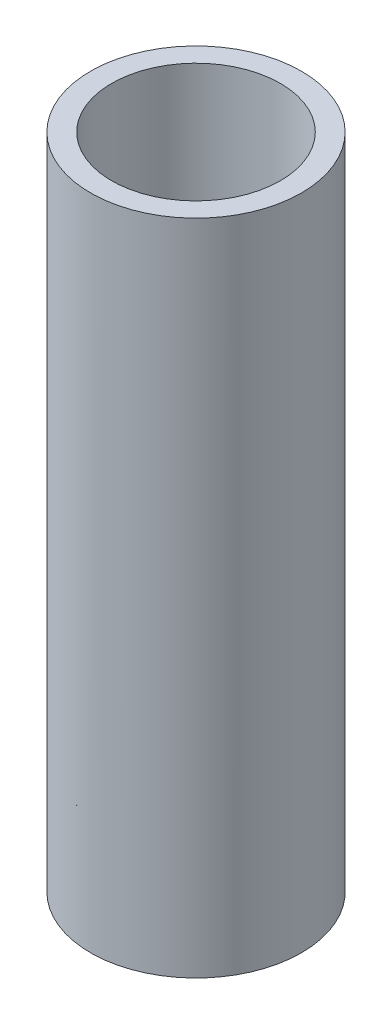
ISO-10303-21;
HEADER;
FILE_DESCRIPTION(('STEP AP214'),'2;1');
FILE_NAME('part.step','',(''),(''),'','','');
FILE_SCHEMA(('AUTOMOTIVE_DESIGN { 1 0 10303 214 1 1 1 1 }'));
ENDSEC;
DATA;
#1=APPLICATION_CONTEXT('core data for automotive mechanical design processes');
#2=APPLICATION_PROTOCOL_DEFINITION('international standard','automotive_design',2000,#1);
#3=PRODUCT_CONTEXT('',#1,'mechanical');
#4=PRODUCT('Part','Part','',(#3));
#5=PRODUCT_RELATED_PRODUCT_CATEGORY('part','',(#4));
#6=PRODUCT_DEFINITION_FORMATION('','',#4);
#7=PRODUCT_DEFINITION_CONTEXT('part definition',#1,'design');
#8=PRODUCT_DEFINITION('design','',#6,#7);
#9=PRODUCT_DEFINITION_SHAPE('','',#8);
#10=(LENGTH_UNIT() NAMED_UNIT(*) SI_UNIT(.MILLI.,.METRE.));
#11=(NAMED_UNIT(*) PLANE_ANGLE_UNIT() SI_UNIT($,.RADIAN.));
#12=(NAMED_UNIT(*) SI_UNIT($,.STERADIAN.) SOLID_ANGLE_UNIT());
#13=UNCERTAINTY_MEASURE_WITH_UNIT(LENGTH_MEASURE(1.E-05),#10,'distance_accuracy_value','');
#14=(GEOMETRIC_REPRESENTATION_CONTEXT(3) GLOBAL_UNCERTAINTY_ASSIGNED_CONTEXT((#13)) GLOBAL_UNIT_ASSIGNED_CONTEXT((#10,
#11,#12)) REPRESENTATION_CONTEXT('',''));
#15=CARTESIAN_POINT('',(0.,0.,0.));
#16=DIRECTION('',(0.,0.,1.));
#17=DIRECTION('',(1.,0.,0.));
#18=AXIS2_PLACEMENT_3D('',#15,#16,#17);
#19=CARTESIAN_POINT('',(-12.7,-1.905,19.05));
#20=DIRECTION('',(0.,-1.,0.));
#21=DIRECTION('',(1.,0.,0.));
#22=AXIS2_PLACEMENT_3D('',#19,#20,#21);
#23=PLANE('',#22);
#24=CARTESIAN_POINT('',(-31.75,-1.90499999999999,0.));
#25=DIRECTION('',(0.,-1.,0.));
#26=DIRECTION('',(1.,0.,0.));
#27=AXIS2_PLACEMENT_3D('',#24,#25,#26);
#28=CIRCLE('',#27,15.875);
#29=CARTESIAN_POINT('',(-15.875,-1.90499999999999,0.));
#30=VERTEX_POINT('',#29);
#31=EDGE_CURVE('E44',#30,#30,#28,.F.);
#32=ORIENTED_EDGE('',*,*,#31,.F.);
#33=EDGE_LOOP('',(#32));
#34=FACE_BOUND('',#33,.T.);
#35=CARTESIAN_POINT('',(-31.75,-1.90499999999999,0.));
#36=DIRECTION('',(0.,-1.,0.));
#37=DIRECTION('',(1.,0.,0.));
#38=AXIS2_PLACEMENT_3D('',#35,#36,#37);
#39=CIRCLE('',#38,12.7);
#40=CARTESIAN_POINT('',(-19.05,-1.90499999999999,0.));
#41=VERTEX_POINT('',#40);
#42=EDGE_CURVE('E36',#41,#41,#39,.T.);
#43=ORIENTED_EDGE('',*,*,#42,.F.);
#44=EDGE_LOOP('',(#43));
#45=FACE_BOUND('',#44,.T.);
#46=ADVANCED_FACE('F33',(#34,#45),#23,.T.);
#47=CARTESIAN_POINT('',(-17.7800000000001,97.155,-19.05));
#48=DIRECTION('',(0.,-1.,0.));
#49=DIRECTION('',(0.,0.,-1.));
#50=AXIS2_PLACEMENT_3D('',#47,#48,#49);
#51=PLANE('',#50);
#52=CARTESIAN_POINT('',(-31.75,97.155,0.));
#53=DIRECTION('',(0.,-1.,0.));
#54=DIRECTION('',(0.,0.,-1.));
#55=AXIS2_PLACEMENT_3D('',#52,#53,#54);
#56=CIRCLE('',#55,12.7);
#57=CARTESIAN_POINT('',(-31.75,97.155,-12.7));
#58=VERTEX_POINT('',#57);
#59=EDGE_CURVE('E46',#58,#58,#56,.T.);
#60=ORIENTED_EDGE('',*,*,#59,.T.);
#61=EDGE_LOOP('',(#60));
#62=FACE_BOUND('',#61,.T.);
#63=CARTESIAN_POINT('',(-31.75,97.155,0.));
#64=DIRECTION('',(0.,-1.,0.));
#65=DIRECTION('',(0.,0.,-1.));
#66=AXIS2_PLACEMENT_3D('',#63,#64,#65);
#67=CIRCLE('',#66,15.875);
#68=CARTESIAN_POINT('',(-31.75,97.155,-15.875));
#69=VERTEX_POINT('',#68);
#70=EDGE_CURVE('E10',#69,#69,#67,.T.);
#71=ORIENTED_EDGE('',*,*,#70,.F.);
#72=EDGE_LOOP('',(#71));
#73=FACE_BOUND('',#72,.T.);
#74=ADVANCED_FACE('F53',(#62,#73),#51,.F.);
#75=CARTESIAN_POINT('',(-31.75,140.151280605346,0.));
#76=DIRECTION('',(0.,-1.,0.));
#77=DIRECTION('',(1.,0.,0.));
#78=AXIS2_PLACEMENT_3D('',#75,#76,#77);
#79=CYLINDRICAL_SURFACE('',#78,15.875);
#80=ORIENTED_EDGE('',*,*,#70,.T.);
#81=EDGE_LOOP('',(#80));
#82=FACE_BOUND('',#81,.T.);
#83=ORIENTED_EDGE('',*,*,#31,.T.);
#84=EDGE_LOOP('',(#83));
#85=FACE_BOUND('',#84,.T.);
#86=ADVANCED_FACE('F59',(#82,#85),#79,.T.);
#87=CARTESIAN_POINT('',(-31.75,140.151280605346,0.));
#88=DIRECTION('',(0.,-1.,0.));
#89=DIRECTION('',(1.,0.,0.));
#90=AXIS2_PLACEMENT_3D('',#87,#88,#89);
#91=CYLINDRICAL_SURFACE('',#90,12.7);
#92=ORIENTED_EDGE('',*,*,#59,.F.);
#93=EDGE_LOOP('',(#92));
#94=FACE_BOUND('',#93,.T.);
#95=ORIENTED_EDGE('',*,*,#42,.T.);
#96=EDGE_LOOP('',(#95));
#97=FACE_BOUND('',#96,.T.);
#98=ADVANCED_FACE('F56',(#94,#97),#91,.F.);
#99=CLOSED_SHELL('',(#46,#74,#86,#98));
#100=MANIFOLD_SOLID_BREP('B2',#99);
#101=ADVANCED_BREP_SHAPE_REPRESENTATION('',(#18,#100),#14);
#102=SHAPE_DEFINITION_REPRESENTATION(#9,#101);
ENDSEC;
END-ISO-10303-21;
